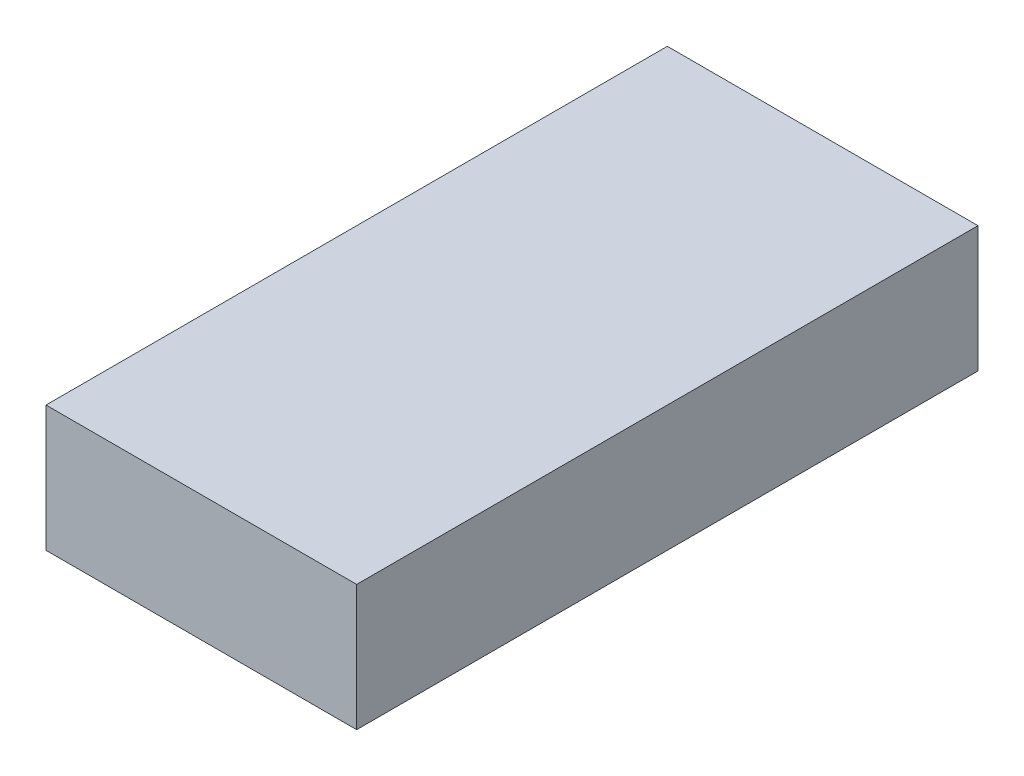
ISO-10303-21;
HEADER;
FILE_DESCRIPTION(('STEP AP214'),'2;1');
FILE_NAME('part.step','',(''),(''),'','','');
FILE_SCHEMA(('AUTOMOTIVE_DESIGN { 1 0 10303 214 1 1 1 1 }'));
ENDSEC;
DATA;
#1=APPLICATION_CONTEXT('core data for automotive mechanical design processes');
#2=APPLICATION_PROTOCOL_DEFINITION('international standard','automotive_design',2000,#1);
#3=PRODUCT_CONTEXT('',#1,'mechanical');
#4=PRODUCT('Part','Part','',(#3));
#5=PRODUCT_RELATED_PRODUCT_CATEGORY('part','',(#4));
#6=PRODUCT_DEFINITION_FORMATION('','',#4);
#7=PRODUCT_DEFINITION_CONTEXT('part definition',#1,'design');
#8=PRODUCT_DEFINITION('design','',#6,#7);
#9=PRODUCT_DEFINITION_SHAPE('','',#8);
#10=(LENGTH_UNIT() NAMED_UNIT(*) SI_UNIT(.MILLI.,.METRE.));
#11=(NAMED_UNIT(*) PLANE_ANGLE_UNIT() SI_UNIT($,.RADIAN.));
#12=(NAMED_UNIT(*) SI_UNIT($,.STERADIAN.) SOLID_ANGLE_UNIT());
#13=UNCERTAINTY_MEASURE_WITH_UNIT(LENGTH_MEASURE(1.E-05),#10,'distance_accuracy_value','');
#14=(GEOMETRIC_REPRESENTATION_CONTEXT(3) GLOBAL_UNCERTAINTY_ASSIGNED_CONTEXT((#13)) GLOBAL_UNIT_ASSIGNED_CONTEXT((#10,
#11,#12)) REPRESENTATION_CONTEXT('',''));
#15=CARTESIAN_POINT('',(0.,0.,0.));
#16=DIRECTION('',(0.,0.,1.));
#17=DIRECTION('',(1.,0.,0.));
#18=AXIS2_PLACEMENT_3D('',#15,#16,#17);
#19=CARTESIAN_POINT('',(0.681967213114738,0.,7.9));
#20=DIRECTION('',(0.,1.,0.));
#21=DIRECTION('',(0.,0.,1.));
#22=AXIS2_PLACEMENT_3D('',#19,#20,#21);
#23=PLANE('',#22);
#24=DIRECTION('',(1.,0.,0.));
#25=VECTOR('',#24,1.);
#26=CARTESIAN_POINT('',(0.681967213114738,0.,-7.9));
#27=LINE('',#26,#25);
#28=CARTESIAN_POINT('',(0.681967213114738,0.,-7.9));
#29=VERTEX_POINT('',#28);
#30=CARTESIAN_POINT('',(8.58196721311474,0.,-7.9));
#31=VERTEX_POINT('',#30);
#32=EDGE_CURVE('E164',#29,#31,#27,.T.);
#33=ORIENTED_EDGE('',*,*,#32,.T.);
#34=DIRECTION('',(0.,0.,-1.));
#35=VECTOR('',#34,1.);
#36=CARTESIAN_POINT('',(8.58196721311474,0.,7.9));
#37=LINE('',#36,#35);
#38=CARTESIAN_POINT('',(8.58196721311474,0.,7.9));
#39=VERTEX_POINT('',#38);
#40=EDGE_CURVE('E49',#39,#31,#37,.T.);
#41=ORIENTED_EDGE('',*,*,#40,.F.);
#42=DIRECTION('',(1.,0.,0.));
#43=VECTOR('',#42,1.);
#44=CARTESIAN_POINT('',(0.681967213114738,0.,7.9));
#45=LINE('',#44,#43);
#46=CARTESIAN_POINT('',(0.681967213114738,0.,7.9));
#47=VERTEX_POINT('',#46);
#48=EDGE_CURVE('E93',#47,#39,#45,.T.);
#49=ORIENTED_EDGE('',*,*,#48,.F.);
#50=DIRECTION('',(0.,0.,-1.));
#51=VECTOR('',#50,1.);
#52=CARTESIAN_POINT('',(0.681967213114738,0.,7.9));
#53=LINE('',#52,#51);
#54=EDGE_CURVE('E11',#47,#29,#53,.T.);
#55=ORIENTED_EDGE('',*,*,#54,.T.);
#56=EDGE_LOOP('',(#33,#41,#49,#55));
#57=FACE_BOUND('',#56,.T.);
#58=DIRECTION('',(1.,0.,0.));
#59=VECTOR('',#58,1.);
#60=CARTESIAN_POINT('',(0.,0.,-6.7));
#61=LINE('',#60,#59);
#62=CARTESIAN_POINT('',(1.88196721311474,0.,-6.7));
#63=VERTEX_POINT('',#62);
#64=CARTESIAN_POINT('',(7.38196721311474,0.,-6.7));
#65=VERTEX_POINT('',#64);
#66=EDGE_CURVE('E137',#63,#65,#61,.T.);
#67=ORIENTED_EDGE('',*,*,#66,.F.);
#68=DIRECTION('',(0.,0.,-1.));
#69=VECTOR('',#68,1.);
#70=CARTESIAN_POINT('',(1.88196721311474,0.,7.9));
#71=LINE('',#70,#69);
#72=CARTESIAN_POINT('',(1.88196721311474,0.,6.7));
#73=VERTEX_POINT('',#72);
#74=EDGE_CURVE('E136',#73,#63,#71,.T.);
#75=ORIENTED_EDGE('',*,*,#74,.F.);
#76=DIRECTION('',(1.,0.,0.));
#77=VECTOR('',#76,1.);
#78=CARTESIAN_POINT('',(0.,0.,6.7));
#79=LINE('',#78,#77);
#80=CARTESIAN_POINT('',(7.38196721311474,0.,6.7));
#81=VERTEX_POINT('',#80);
#82=EDGE_CURVE('E141',#73,#81,#79,.T.);
#83=ORIENTED_EDGE('',*,*,#82,.T.);
#84=DIRECTION('',(0.,0.,-1.));
#85=VECTOR('',#84,1.);
#86=CARTESIAN_POINT('',(7.38196721311474,0.,7.9));
#87=LINE('',#86,#85);
#88=EDGE_CURVE('E146',#81,#65,#87,.T.);
#89=ORIENTED_EDGE('',*,*,#88,.T.);
#90=EDGE_LOOP('',(#67,#75,#83,#89));
#91=FACE_BOUND('',#90,.T.);
#92=ADVANCED_FACE('F41',(#57,#91),#23,.F.);
#93=CARTESIAN_POINT('',(0.681967213114738,0.,7.9));
#94=DIRECTION('',(1.,0.,0.));
#95=DIRECTION('',(0.,0.,-1.));
#96=AXIS2_PLACEMENT_3D('',#93,#94,#95);
#97=PLANE('',#96);
#98=DIRECTION('',(0.,-1.,0.));
#99=VECTOR('',#98,1.);
#100=CARTESIAN_POINT('',(0.681967213114738,0.,-7.9));
#101=LINE('',#100,#99);
#102=CARTESIAN_POINT('',(0.681967213114738,3.2,-7.9));
#103=VERTEX_POINT('',#102);
#104=EDGE_CURVE('E149',#103,#29,#101,.T.);
#105=ORIENTED_EDGE('',*,*,#104,.T.);
#106=ORIENTED_EDGE('',*,*,#54,.F.);
#107=DIRECTION('',(0.,-1.,0.));
#108=VECTOR('',#107,1.);
#109=CARTESIAN_POINT('',(0.681967213114738,0.,7.9));
#110=LINE('',#109,#108);
#111=CARTESIAN_POINT('',(0.681967213114738,3.2,7.9));
#112=VERTEX_POINT('',#111);
#113=EDGE_CURVE('E155',#112,#47,#110,.T.);
#114=ORIENTED_EDGE('',*,*,#113,.F.);
#115=DIRECTION('',(0.,0.,-1.));
#116=VECTOR('',#115,1.);
#117=CARTESIAN_POINT('',(0.681967213114738,3.2,7.9));
#118=LINE('',#117,#116);
#119=EDGE_CURVE('E161',#112,#103,#118,.T.);
#120=ORIENTED_EDGE('',*,*,#119,.T.);
#121=EDGE_LOOP('',(#105,#106,#114,#120));
#122=FACE_BOUND('',#121,.T.);
#123=ADVANCED_FACE('F43',(#122),#97,.F.);
#124=CARTESIAN_POINT('',(8.58196721311474,0.,7.9));
#125=DIRECTION('',(-1.,0.,0.));
#126=DIRECTION('',(0.,0.,1.));
#127=AXIS2_PLACEMENT_3D('',#124,#125,#126);
#128=PLANE('',#127);
#129=DIRECTION('',(0.,1.,0.));
#130=VECTOR('',#129,1.);
#131=CARTESIAN_POINT('',(8.58196721311474,0.,-7.9));
#132=LINE('',#131,#130);
#133=CARTESIAN_POINT('',(8.58196721311474,3.2,-7.9));
#134=VERTEX_POINT('',#133);
#135=EDGE_CURVE('E166',#31,#134,#132,.T.);
#136=ORIENTED_EDGE('',*,*,#135,.T.);
#137=DIRECTION('',(0.,0.,-1.));
#138=VECTOR('',#137,1.);
#139=CARTESIAN_POINT('',(8.58196721311474,3.2,7.9));
#140=LINE('',#139,#138);
#141=CARTESIAN_POINT('',(8.58196721311474,3.2,7.9));
#142=VERTEX_POINT('',#141);
#143=EDGE_CURVE('E170',#142,#134,#140,.T.);
#144=ORIENTED_EDGE('',*,*,#143,.F.);
#145=DIRECTION('',(0.,1.,0.));
#146=VECTOR('',#145,1.);
#147=CARTESIAN_POINT('',(8.58196721311474,0.,7.9));
#148=LINE('',#147,#146);
#149=EDGE_CURVE('E158',#39,#142,#148,.T.);
#150=ORIENTED_EDGE('',*,*,#149,.F.);
#151=ORIENTED_EDGE('',*,*,#40,.T.);
#152=EDGE_LOOP('',(#136,#144,#150,#151));
#153=FACE_BOUND('',#152,.T.);
#154=ADVANCED_FACE('F175',(#153),#128,.F.);
#155=CARTESIAN_POINT('',(0.681967213114738,3.2,7.9));
#156=DIRECTION('',(0.,-1.,0.));
#157=DIRECTION('',(1.,0.,0.));
#158=AXIS2_PLACEMENT_3D('',#155,#156,#157);
#159=PLANE('',#158);
#160=DIRECTION('',(-1.,0.,0.));
#161=VECTOR('',#160,1.);
#162=CARTESIAN_POINT('',(0.681967213114738,3.2,-7.9));
#163=LINE('',#162,#161);
#164=EDGE_CURVE('E86',#134,#103,#163,.T.);
#165=ORIENTED_EDGE('',*,*,#164,.T.);
#166=ORIENTED_EDGE('',*,*,#119,.F.);
#167=DIRECTION('',(-1.,0.,0.));
#168=VECTOR('',#167,1.);
#169=CARTESIAN_POINT('',(0.681967213114738,3.2,7.9));
#170=LINE('',#169,#168);
#171=EDGE_CURVE('E65',#142,#112,#170,.T.);
#172=ORIENTED_EDGE('',*,*,#171,.F.);
#173=ORIENTED_EDGE('',*,*,#143,.T.);
#174=EDGE_LOOP('',(#165,#166,#172,#173));
#175=FACE_BOUND('',#174,.T.);
#176=ADVANCED_FACE('F183',(#175),#159,.F.);
#177=CARTESIAN_POINT('',(0.,0.,7.9));
#178=DIRECTION('',(0.,0.,-1.));
#179=DIRECTION('',(-1.,0.,0.));
#180=AXIS2_PLACEMENT_3D('',#177,#178,#179);
#181=PLANE('',#180);
#182=ORIENTED_EDGE('',*,*,#113,.T.);
#183=ORIENTED_EDGE('',*,*,#48,.T.);
#184=ORIENTED_EDGE('',*,*,#149,.T.);
#185=ORIENTED_EDGE('',*,*,#171,.T.);
#186=EDGE_LOOP('',(#182,#183,#184,#185));
#187=FACE_BOUND('',#186,.T.);
#188=ADVANCED_FACE('F185',(#187),#181,.F.);
#189=CARTESIAN_POINT('',(0.,0.,-7.9));
#190=DIRECTION('',(0.,0.,-1.));
#191=DIRECTION('',(-1.,0.,0.));
#192=AXIS2_PLACEMENT_3D('',#189,#190,#191);
#193=PLANE('',#192);
#194=ORIENTED_EDGE('',*,*,#104,.F.);
#195=ORIENTED_EDGE('',*,*,#164,.F.);
#196=ORIENTED_EDGE('',*,*,#135,.F.);
#197=ORIENTED_EDGE('',*,*,#32,.F.);
#198=EDGE_LOOP('',(#194,#195,#196,#197));
#199=FACE_BOUND('',#198,.T.);
#200=ADVANCED_FACE('F179',(#199),#193,.T.);
#201=CARTESIAN_POINT('',(1.88196721311474,0.,7.9));
#202=DIRECTION('',(1.,0.,0.));
#203=DIRECTION('',(0.,0.,-1.));
#204=AXIS2_PLACEMENT_3D('',#201,#202,#203);
#205=PLANE('',#204);
#206=DIRECTION('',(0.,-1.,0.));
#207=VECTOR('',#206,1.);
#208=CARTESIAN_POINT('',(1.88196721311474,0.,-6.7));
#209=LINE('',#208,#207);
#210=CARTESIAN_POINT('',(1.88196721311474,2.,-6.7));
#211=VERTEX_POINT('',#210);
#212=EDGE_CURVE('E120',#211,#63,#209,.T.);
#213=ORIENTED_EDGE('',*,*,#212,.F.);
#214=DIRECTION('',(0.,0.,-1.));
#215=VECTOR('',#214,1.);
#216=CARTESIAN_POINT('',(1.88196721311474,2.,7.9));
#217=LINE('',#216,#215);
#218=CARTESIAN_POINT('',(1.88196721311474,2.,6.7));
#219=VERTEX_POINT('',#218);
#220=EDGE_CURVE('E128',#219,#211,#217,.T.);
#221=ORIENTED_EDGE('',*,*,#220,.F.);
#222=DIRECTION('',(0.,-1.,0.));
#223=VECTOR('',#222,1.);
#224=CARTESIAN_POINT('',(1.88196721311474,0.,6.7));
#225=LINE('',#224,#223);
#226=EDGE_CURVE('E56',#219,#73,#225,.T.);
#227=ORIENTED_EDGE('',*,*,#226,.T.);
#228=ORIENTED_EDGE('',*,*,#74,.T.);
#229=EDGE_LOOP('',(#213,#221,#227,#228));
#230=FACE_BOUND('',#229,.T.);
#231=ADVANCED_FACE('F134',(#230),#205,.T.);
#232=CARTESIAN_POINT('',(7.38196721311474,0.,7.9));
#233=DIRECTION('',(-1.,0.,0.));
#234=DIRECTION('',(0.,0.,1.));
#235=AXIS2_PLACEMENT_3D('',#232,#233,#234);
#236=PLANE('',#235);
#237=DIRECTION('',(0.,1.,0.));
#238=VECTOR('',#237,1.);
#239=CARTESIAN_POINT('',(7.38196721311474,0.,-6.7));
#240=LINE('',#239,#238);
#241=CARTESIAN_POINT('',(7.38196721311474,2.,-6.7));
#242=VERTEX_POINT('',#241);
#243=EDGE_CURVE('E123',#65,#242,#240,.T.);
#244=ORIENTED_EDGE('',*,*,#243,.F.);
#245=ORIENTED_EDGE('',*,*,#88,.F.);
#246=DIRECTION('',(0.,1.,0.));
#247=VECTOR('',#246,1.);
#248=CARTESIAN_POINT('',(7.38196721311474,0.,6.7));
#249=LINE('',#248,#247);
#250=CARTESIAN_POINT('',(7.38196721311474,2.,6.7));
#251=VERTEX_POINT('',#250);
#252=EDGE_CURVE('E144',#81,#251,#249,.T.);
#253=ORIENTED_EDGE('',*,*,#252,.T.);
#254=DIRECTION('',(0.,0.,-1.));
#255=VECTOR('',#254,1.);
#256=CARTESIAN_POINT('',(7.38196721311474,2.,7.9));
#257=LINE('',#256,#255);
#258=EDGE_CURVE('E132',#251,#242,#257,.T.);
#259=ORIENTED_EDGE('',*,*,#258,.T.);
#260=EDGE_LOOP('',(#244,#245,#253,#259));
#261=FACE_BOUND('',#260,.T.);
#262=ADVANCED_FACE('F201',(#261),#236,.T.);
#263=CARTESIAN_POINT('',(0.681967213114738,2.,7.9));
#264=DIRECTION('',(0.,-1.,0.));
#265=DIRECTION('',(1.,0.,0.));
#266=AXIS2_PLACEMENT_3D('',#263,#264,#265);
#267=PLANE('',#266);
#268=DIRECTION('',(-1.,0.,0.));
#269=VECTOR('',#268,1.);
#270=CARTESIAN_POINT('',(0.,2.,-6.7));
#271=LINE('',#270,#269);
#272=EDGE_CURVE('E116',#242,#211,#271,.T.);
#273=ORIENTED_EDGE('',*,*,#272,.F.);
#274=ORIENTED_EDGE('',*,*,#258,.F.);
#275=DIRECTION('',(-1.,0.,0.));
#276=VECTOR('',#275,1.);
#277=CARTESIAN_POINT('',(0.,2.,6.7));
#278=LINE('',#277,#276);
#279=EDGE_CURVE('E131',#251,#219,#278,.T.);
#280=ORIENTED_EDGE('',*,*,#279,.T.);
#281=ORIENTED_EDGE('',*,*,#220,.T.);
#282=EDGE_LOOP('',(#273,#274,#280,#281));
#283=FACE_BOUND('',#282,.T.);
#284=ADVANCED_FACE('F129',(#283),#267,.T.);
#285=CARTESIAN_POINT('',(0.,0.,6.7));
#286=DIRECTION('',(0.,0.,-1.));
#287=DIRECTION('',(-1.,0.,0.));
#288=AXIS2_PLACEMENT_3D('',#285,#286,#287);
#289=PLANE('',#288);
#290=ORIENTED_EDGE('',*,*,#226,.F.);
#291=ORIENTED_EDGE('',*,*,#279,.F.);
#292=ORIENTED_EDGE('',*,*,#252,.F.);
#293=ORIENTED_EDGE('',*,*,#82,.F.);
#294=EDGE_LOOP('',(#290,#291,#292,#293));
#295=FACE_BOUND('',#294,.T.);
#296=ADVANCED_FACE('F204',(#295),#289,.T.);
#297=CARTESIAN_POINT('',(0.,0.,-6.7));
#298=DIRECTION('',(0.,0.,-1.));
#299=DIRECTION('',(-1.,0.,0.));
#300=AXIS2_PLACEMENT_3D('',#297,#298,#299);
#301=PLANE('',#300);
#302=ORIENTED_EDGE('',*,*,#212,.T.);
#303=ORIENTED_EDGE('',*,*,#66,.T.);
#304=ORIENTED_EDGE('',*,*,#243,.T.);
#305=ORIENTED_EDGE('',*,*,#272,.T.);
#306=EDGE_LOOP('',(#302,#303,#304,#305));
#307=FACE_BOUND('',#306,.T.);
#308=ADVANCED_FACE('F118',(#307),#301,.F.);
#309=CLOSED_SHELL('',(#92,#123,#154,#176,#188,#200,#231,#262,#284,#296,#308));
#310=MANIFOLD_SOLID_BREP('B2',#309);
#311=ADVANCED_BREP_SHAPE_REPRESENTATION('',(#18,#310),#14);
#312=SHAPE_DEFINITION_REPRESENTATION(#9,#311);
ENDSEC;
END-ISO-10303-21;
